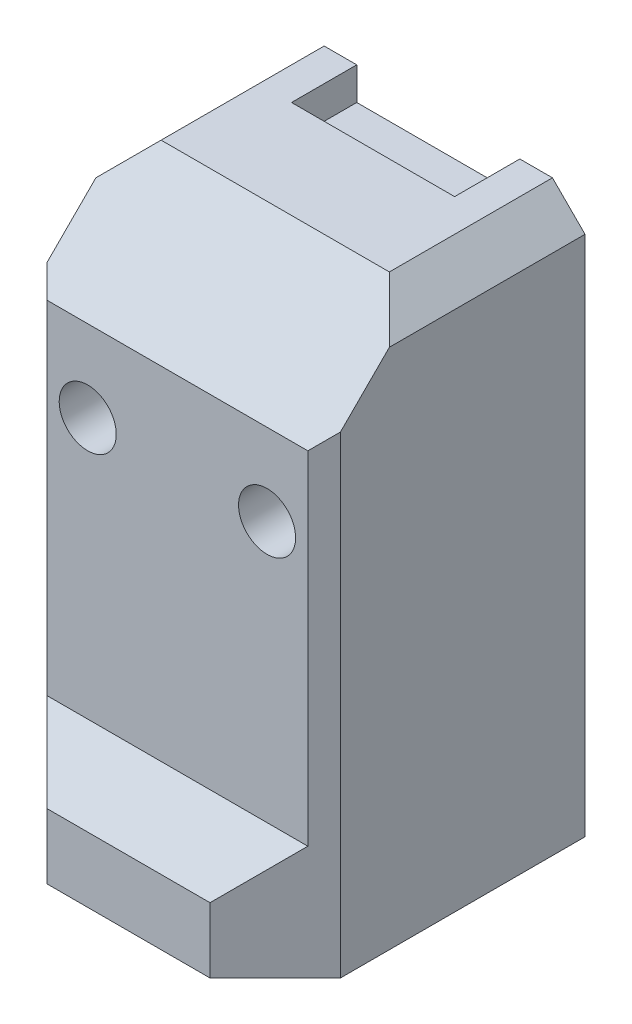
ISO-10303-21;
HEADER;
FILE_DESCRIPTION(('STEP AP214'),'2;1');
FILE_NAME('part.step','',(''),(''),'','','');
FILE_SCHEMA(('AUTOMOTIVE_DESIGN { 1 0 10303 214 1 1 1 1 }'));
ENDSEC;
DATA;
#1=APPLICATION_CONTEXT('core data for automotive mechanical design processes');
#2=APPLICATION_PROTOCOL_DEFINITION('international standard','automotive_design',2000,#1);
#3=PRODUCT_CONTEXT('',#1,'mechanical');
#4=PRODUCT('Part','Part','',(#3));
#5=PRODUCT_RELATED_PRODUCT_CATEGORY('part','',(#4));
#6=PRODUCT_DEFINITION_FORMATION('','',#4);
#7=PRODUCT_DEFINITION_CONTEXT('part definition',#1,'design');
#8=PRODUCT_DEFINITION('design','',#6,#7);
#9=PRODUCT_DEFINITION_SHAPE('','',#8);
#10=(LENGTH_UNIT() NAMED_UNIT(*) SI_UNIT(.MILLI.,.METRE.));
#11=(NAMED_UNIT(*) PLANE_ANGLE_UNIT() SI_UNIT($,.RADIAN.));
#12=(NAMED_UNIT(*) SI_UNIT($,.STERADIAN.) SOLID_ANGLE_UNIT());
#13=UNCERTAINTY_MEASURE_WITH_UNIT(LENGTH_MEASURE(1.E-05),#10,'distance_accuracy_value','');
#14=(GEOMETRIC_REPRESENTATION_CONTEXT(3) GLOBAL_UNCERTAINTY_ASSIGNED_CONTEXT((#13)) GLOBAL_UNIT_ASSIGNED_CONTEXT((#10,
#11,#12)) REPRESENTATION_CONTEXT('',''));
#15=CARTESIAN_POINT('',(0.,0.,0.));
#16=DIRECTION('',(0.,0.,1.));
#17=DIRECTION('',(1.,0.,0.));
#18=AXIS2_PLACEMENT_3D('',#15,#16,#17);
#19=CARTESIAN_POINT('',(0.,0.,19.));
#20=DIRECTION('',(0.,0.,1.));
#21=DIRECTION('',(1.,0.,0.));
#22=AXIS2_PLACEMENT_3D('',#19,#20,#21);
#23=PLANE('',#22);
#24=DIRECTION('',(1.,0.,0.));
#25=VECTOR('',#24,1.);
#26=CARTESIAN_POINT('',(-9.,-13.,19.));
#27=LINE('',#26,#25);
#28=CARTESIAN_POINT('',(-5.,-13.,19.));
#29=VERTEX_POINT('',#28);
#30=CARTESIAN_POINT('',(5.,-13.,19.));
#31=VERTEX_POINT('',#30);
#32=EDGE_CURVE('E194',#29,#31,#27,.T.);
#33=ORIENTED_EDGE('',*,*,#32,.F.);
#34=DIRECTION('',(0.,-1.,0.));
#35=VECTOR('',#34,1.);
#36=CARTESIAN_POINT('',(-5.,-17.,19.));
#37=LINE('',#36,#35);
#38=CARTESIAN_POINT('',(-5.,-17.,19.));
#39=VERTEX_POINT('',#38);
#40=EDGE_CURVE('E296',#29,#39,#37,.T.);
#41=ORIENTED_EDGE('',*,*,#40,.T.);
#42=DIRECTION('',(1.,0.,0.));
#43=VECTOR('',#42,1.);
#44=CARTESIAN_POINT('',(-9.,-17.,19.));
#45=LINE('',#44,#43);
#46=CARTESIAN_POINT('',(5.,-17.,19.));
#47=VERTEX_POINT('',#46);
#48=EDGE_CURVE('E220',#39,#47,#45,.T.);
#49=ORIENTED_EDGE('',*,*,#48,.T.);
#50=DIRECTION('',(0.,1.,0.));
#51=VECTOR('',#50,1.);
#52=CARTESIAN_POINT('',(5.,-13.,19.));
#53=LINE('',#52,#51);
#54=EDGE_CURVE('E292',#47,#31,#53,.T.);
#55=ORIENTED_EDGE('',*,*,#54,.T.);
#56=EDGE_LOOP('',(#33,#41,#49,#55));
#57=FACE_BOUND('',#56,.T.);
#58=ADVANCED_FACE('F45',(#57),#23,.T.);
#59=CARTESIAN_POINT('',(0.,0.,0.));
#60=DIRECTION('',(0.,0.,1.));
#61=DIRECTION('',(1.,0.,0.));
#62=AXIS2_PLACEMENT_3D('',#59,#60,#61);
#63=PLANE('',#62);
#64=DIRECTION('',(-1.,0.,0.));
#65=VECTOR('',#64,1.);
#66=CARTESIAN_POINT('',(-9.,17.,0.));
#67=LINE('',#66,#65);
#68=CARTESIAN_POINT('',(-5.,17.,0.));
#69=VERTEX_POINT('',#68);
#70=CARTESIAN_POINT('',(-7.,17.,0.));
#71=VERTEX_POINT('',#70);
#72=EDGE_CURVE('E229',#69,#71,#67,.T.);
#73=ORIENTED_EDGE('',*,*,#72,.F.);
#74=DIRECTION('',(0.,1.,0.));
#75=VECTOR('',#74,1.);
#76=CARTESIAN_POINT('',(-5.,15.,0.));
#77=LINE('',#76,#75);
#78=CARTESIAN_POINT('',(-5.,15.,0.));
#79=VERTEX_POINT('',#78);
#80=EDGE_CURVE('E191',#79,#69,#77,.T.);
#81=ORIENTED_EDGE('',*,*,#80,.F.);
#82=DIRECTION('',(-1.,0.,0.));
#83=VECTOR('',#82,1.);
#84=CARTESIAN_POINT('',(-5.,15.,0.));
#85=LINE('',#84,#83);
#86=CARTESIAN_POINT('',(5.,15.,0.));
#87=VERTEX_POINT('',#86);
#88=EDGE_CURVE('E162',#87,#79,#85,.T.);
#89=ORIENTED_EDGE('',*,*,#88,.F.);
#90=DIRECTION('',(0.,1.,0.));
#91=VECTOR('',#90,1.);
#92=CARTESIAN_POINT('',(5.,15.,0.));
#93=LINE('',#92,#91);
#94=CARTESIAN_POINT('',(5.,17.,0.));
#95=VERTEX_POINT('',#94);
#96=EDGE_CURVE('E195',#87,#95,#93,.T.);
#97=ORIENTED_EDGE('',*,*,#96,.T.);
#98=CARTESIAN_POINT('',(7.,17.,0.));
#99=VERTEX_POINT('',#98);
#100=EDGE_CURVE('E230',#99,#95,#67,.T.);
#101=ORIENTED_EDGE('',*,*,#100,.F.);
#102=DIRECTION('',(-0.707106781186546,0.707106781186549,0.));
#103=VECTOR('',#102,1.);
#104=CARTESIAN_POINT('',(7.,17.,0.));
#105=LINE('',#104,#103);
#106=CARTESIAN_POINT('',(9.,15.,0.));
#107=VERTEX_POINT('',#106);
#108=EDGE_CURVE('E268',#99,#107,#105,.F.);
#109=ORIENTED_EDGE('',*,*,#108,.T.);
#110=DIRECTION('',(0.,1.,0.));
#111=VECTOR('',#110,1.);
#112=CARTESIAN_POINT('',(9.,17.,0.));
#113=LINE('',#112,#111);
#114=CARTESIAN_POINT('',(9.,-17.,0.));
#115=VERTEX_POINT('',#114);
#116=EDGE_CURVE('E219',#115,#107,#113,.T.);
#117=ORIENTED_EDGE('',*,*,#116,.F.);
#118=DIRECTION('',(1.,0.,0.));
#119=VECTOR('',#118,1.);
#120=CARTESIAN_POINT('',(-9.,-17.,0.));
#121=LINE('',#120,#119);
#122=CARTESIAN_POINT('',(-9.,-17.,0.));
#123=VERTEX_POINT('',#122);
#124=EDGE_CURVE('E225',#123,#115,#121,.T.);
#125=ORIENTED_EDGE('',*,*,#124,.F.);
#126=DIRECTION('',(0.,-1.,0.));
#127=VECTOR('',#126,1.);
#128=CARTESIAN_POINT('',(-9.,17.,0.));
#129=LINE('',#128,#127);
#130=CARTESIAN_POINT('',(-9.,15.,0.));
#131=VERTEX_POINT('',#130);
#132=EDGE_CURVE('E234',#131,#123,#129,.T.);
#133=ORIENTED_EDGE('',*,*,#132,.F.);
#134=DIRECTION('',(-0.707106781186548,-0.707106781186547,0.));
#135=VECTOR('',#134,1.);
#136=CARTESIAN_POINT('',(-9.,15.,0.));
#137=LINE('',#136,#135);
#138=EDGE_CURVE('E271',#131,#71,#137,.F.);
#139=ORIENTED_EDGE('',*,*,#138,.T.);
#140=EDGE_LOOP('',(#73,#81,#89,#97,#101,#109,#117,#125,#133,#139));
#141=FACE_BOUND('',#140,.T.);
#142=CARTESIAN_POINT('',(5.5,6.,0.));
#143=DIRECTION('',(0.,0.,1.));
#144=DIRECTION('',(1.,0.,0.));
#145=AXIS2_PLACEMENT_3D('',#142,#143,#144);
#146=CIRCLE('',#145,1.75);
#147=CARTESIAN_POINT('',(7.25,6.,0.));
#148=VERTEX_POINT('',#147);
#149=EDGE_CURVE('E215',#148,#148,#146,.T.);
#150=ORIENTED_EDGE('',*,*,#149,.T.);
#151=EDGE_LOOP('',(#150));
#152=FACE_BOUND('',#151,.T.);
#153=CARTESIAN_POINT('',(-5.5,6.,0.));
#154=DIRECTION('',(0.,0.,1.));
#155=DIRECTION('',(1.,0.,0.));
#156=AXIS2_PLACEMENT_3D('',#153,#154,#155);
#157=CIRCLE('',#156,1.75);
#158=CARTESIAN_POINT('',(-3.75,6.,0.));
#159=VERTEX_POINT('',#158);
#160=EDGE_CURVE('E211',#159,#159,#157,.T.);
#161=ORIENTED_EDGE('',*,*,#160,.T.);
#162=EDGE_LOOP('',(#161));
#163=FACE_BOUND('',#162,.T.);
#164=ADVANCED_FACE('F347',(#141,#152,#163),#63,.F.);
#165=CARTESIAN_POINT('',(9.,17.,19.));
#166=DIRECTION('',(-1.,0.,0.));
#167=DIRECTION('',(0.,-1.,0.));
#168=AXIS2_PLACEMENT_3D('',#165,#166,#167);
#169=PLANE('',#168);
#170=DIRECTION('',(0.,0.707106781186549,-0.707106781186546));
#171=VECTOR('',#170,1.);
#172=CARTESIAN_POINT('',(9.,17.,9.99999999999999));
#173=LINE('',#172,#171);
#174=CARTESIAN_POINT('',(9.,15.,12.));
#175=VERTEX_POINT('',#174);
#176=CARTESIAN_POINT('',(9.,12.,15.));
#177=VERTEX_POINT('',#176);
#178=EDGE_CURVE('E253',#175,#177,#173,.F.);
#179=ORIENTED_EDGE('',*,*,#178,.T.);
#180=DIRECTION('',(0.,-1.,0.));
#181=VECTOR('',#180,1.);
#182=CARTESIAN_POINT('',(9.,-17.,15.));
#183=LINE('',#182,#181);
#184=CARTESIAN_POINT('',(9.,-17.,15.));
#185=VERTEX_POINT('',#184);
#186=EDGE_CURVE('E11',#177,#185,#183,.T.);
#187=ORIENTED_EDGE('',*,*,#186,.T.);
#188=DIRECTION('',(0.,0.,-1.));
#189=VECTOR('',#188,1.);
#190=CARTESIAN_POINT('',(9.,-17.,19.));
#191=LINE('',#190,#189);
#192=EDGE_CURVE('E224',#185,#115,#191,.T.);
#193=ORIENTED_EDGE('',*,*,#192,.T.);
#194=ORIENTED_EDGE('',*,*,#116,.T.);
#195=DIRECTION('',(0.,0.,1.));
#196=VECTOR('',#195,1.);
#197=CARTESIAN_POINT('',(9.,15.,19.));
#198=LINE('',#197,#196);
#199=EDGE_CURVE('E289',#107,#175,#198,.T.);
#200=ORIENTED_EDGE('',*,*,#199,.T.);
#201=EDGE_LOOP('',(#179,#187,#193,#194,#200));
#202=FACE_BOUND('',#201,.T.);
#203=ADVANCED_FACE('F377',(#202),#169,.F.);
#204=CARTESIAN_POINT('',(-9.,17.,19.));
#205=DIRECTION('',(0.,-1.,0.));
#206=DIRECTION('',(0.,0.,-1.));
#207=AXIS2_PLACEMENT_3D('',#204,#205,#206);
#208=PLANE('',#207);
#209=DIRECTION('',(1.,0.,0.));
#210=VECTOR('',#209,1.);
#211=CARTESIAN_POINT('',(-5.,17.,4.));
#212=LINE('',#211,#210);
#213=CARTESIAN_POINT('',(-5.,17.,4.));
#214=VERTEX_POINT('',#213);
#215=CARTESIAN_POINT('',(5.,17.,4.));
#216=VERTEX_POINT('',#215);
#217=EDGE_CURVE('E180',#214,#216,#212,.T.);
#218=ORIENTED_EDGE('',*,*,#217,.F.);
#219=DIRECTION('',(0.,0.,1.));
#220=VECTOR('',#219,1.);
#221=CARTESIAN_POINT('',(-5.,17.,0.));
#222=LINE('',#221,#220);
#223=EDGE_CURVE('E62',#69,#214,#222,.T.);
#224=ORIENTED_EDGE('',*,*,#223,.F.);
#225=ORIENTED_EDGE('',*,*,#72,.T.);
#226=DIRECTION('',(0.,0.,1.));
#227=VECTOR('',#226,1.);
#228=CARTESIAN_POINT('',(-7.,17.,19.));
#229=LINE('',#228,#227);
#230=CARTESIAN_POINT('',(-7.,17.,9.99999999999999));
#231=VERTEX_POINT('',#230);
#232=EDGE_CURVE('E279',#71,#231,#229,.T.);
#233=ORIENTED_EDGE('',*,*,#232,.T.);
#234=DIRECTION('',(1.,0.,0.));
#235=VECTOR('',#234,1.);
#236=CARTESIAN_POINT('',(-9.,17.,9.99999999999999));
#237=LINE('',#236,#235);
#238=CARTESIAN_POINT('',(7.,17.,9.99999999999999));
#239=VERTEX_POINT('',#238);
#240=EDGE_CURVE('E246',#231,#239,#237,.T.);
#241=ORIENTED_EDGE('',*,*,#240,.T.);
#242=DIRECTION('',(0.,0.,-1.));
#243=VECTOR('',#242,1.);
#244=CARTESIAN_POINT('',(7.,17.,19.));
#245=LINE('',#244,#243);
#246=EDGE_CURVE('E275',#239,#99,#245,.T.);
#247=ORIENTED_EDGE('',*,*,#246,.T.);
#248=ORIENTED_EDGE('',*,*,#100,.T.);
#249=DIRECTION('',(0.,0.,-1.));
#250=VECTOR('',#249,1.);
#251=CARTESIAN_POINT('',(5.,17.,0.));
#252=LINE('',#251,#250);
#253=EDGE_CURVE('E177',#216,#95,#252,.T.);
#254=ORIENTED_EDGE('',*,*,#253,.F.);
#255=EDGE_LOOP('',(#218,#224,#225,#233,#241,#247,#248,#254));
#256=FACE_BOUND('',#255,.T.);
#257=ADVANCED_FACE('F369',(#256),#208,.F.);
#258=CARTESIAN_POINT('',(-9.,17.,19.));
#259=DIRECTION('',(1.,0.,0.));
#260=DIRECTION('',(0.,1.,0.));
#261=AXIS2_PLACEMENT_3D('',#258,#259,#260);
#262=PLANE('',#261);
#263=DIRECTION('',(0.,0.,-1.));
#264=VECTOR('',#263,1.);
#265=CARTESIAN_POINT('',(-9.,-17.,19.));
#266=LINE('',#265,#264);
#267=CARTESIAN_POINT('',(-9.,-17.,15.));
#268=VERTEX_POINT('',#267);
#269=EDGE_CURVE('E243',#268,#123,#266,.T.);
#270=ORIENTED_EDGE('',*,*,#269,.F.);
#271=DIRECTION('',(0.,1.,0.));
#272=VECTOR('',#271,1.);
#273=CARTESIAN_POINT('',(-9.,-13.,15.));
#274=LINE('',#273,#272);
#275=CARTESIAN_POINT('',(-9.,12.,15.));
#276=VERTEX_POINT('',#275);
#277=EDGE_CURVE('E306',#268,#276,#274,.T.);
#278=ORIENTED_EDGE('',*,*,#277,.T.);
#279=DIRECTION('',(0.,-0.707106781186549,0.707106781186546));
#280=VECTOR('',#279,1.);
#281=CARTESIAN_POINT('',(-9.,17.,9.99999999999999));
#282=LINE('',#281,#280);
#283=CARTESIAN_POINT('',(-9.,15.,12.));
#284=VERTEX_POINT('',#283);
#285=EDGE_CURVE('E261',#276,#284,#282,.F.);
#286=ORIENTED_EDGE('',*,*,#285,.T.);
#287=DIRECTION('',(0.,0.,-1.));
#288=VECTOR('',#287,1.);
#289=CARTESIAN_POINT('',(-9.,15.,19.));
#290=LINE('',#289,#288);
#291=EDGE_CURVE('E264',#284,#131,#290,.T.);
#292=ORIENTED_EDGE('',*,*,#291,.T.);
#293=ORIENTED_EDGE('',*,*,#132,.T.);
#294=EDGE_LOOP('',(#270,#278,#286,#292,#293));
#295=FACE_BOUND('',#294,.T.);
#296=ADVANCED_FACE('F339',(#295),#262,.F.);
#297=CARTESIAN_POINT('',(-9.,-17.,19.));
#298=DIRECTION('',(0.,1.,0.));
#299=DIRECTION('',(0.,0.,1.));
#300=AXIS2_PLACEMENT_3D('',#297,#298,#299);
#301=PLANE('',#300);
#302=ORIENTED_EDGE('',*,*,#48,.F.);
#303=DIRECTION('',(-0.707106781186547,0.,-0.707106781186548));
#304=VECTOR('',#303,1.);
#305=CARTESIAN_POINT('',(-5.,-17.,19.));
#306=LINE('',#305,#304);
#307=EDGE_CURVE('E303',#39,#268,#306,.T.);
#308=ORIENTED_EDGE('',*,*,#307,.T.);
#309=ORIENTED_EDGE('',*,*,#269,.T.);
#310=ORIENTED_EDGE('',*,*,#124,.T.);
#311=ORIENTED_EDGE('',*,*,#192,.F.);
#312=DIRECTION('',(-0.707106781186547,0.,0.707106781186548));
#313=VECTOR('',#312,1.);
#314=CARTESIAN_POINT('',(5.,-17.,19.));
#315=LINE('',#314,#313);
#316=EDGE_CURVE('E300',#185,#47,#315,.T.);
#317=ORIENTED_EDGE('',*,*,#316,.T.);
#318=EDGE_LOOP('',(#302,#308,#309,#310,#311,#317));
#319=FACE_BOUND('',#318,.T.);
#320=ADVANCED_FACE('F337',(#319),#301,.F.);
#321=CARTESIAN_POINT('',(5.5,6.,19.));
#322=DIRECTION('',(0.,0.,-1.));
#323=DIRECTION('',(-1.,0.,0.));
#324=AXIS2_PLACEMENT_3D('',#321,#322,#323);
#325=CYLINDRICAL_SURFACE('',#324,1.75);
#326=CARTESIAN_POINT('',(5.5,6.,16.));
#327=DIRECTION('',(0.,0.,-1.));
#328=DIRECTION('',(0.,1.,0.));
#329=AXIS2_PLACEMENT_3D('',#326,#327,#328);
#330=CIRCLE('',#329,1.75);
#331=CARTESIAN_POINT('',(5.5,7.75,16.));
#332=VERTEX_POINT('',#331);
#333=EDGE_CURVE('E207',#332,#332,#330,.T.);
#334=ORIENTED_EDGE('',*,*,#333,.F.);
#335=EDGE_LOOP('',(#334));
#336=FACE_BOUND('',#335,.T.);
#337=ORIENTED_EDGE('',*,*,#149,.F.);
#338=EDGE_LOOP('',(#337));
#339=FACE_BOUND('',#338,.T.);
#340=ADVANCED_FACE('F395',(#336,#339),#325,.F.);
#341=CARTESIAN_POINT('',(-5.5,6.,19.));
#342=DIRECTION('',(0.,0.,-1.));
#343=DIRECTION('',(-1.,0.,0.));
#344=AXIS2_PLACEMENT_3D('',#341,#342,#343);
#345=CYLINDRICAL_SURFACE('',#344,1.75);
#346=CARTESIAN_POINT('',(-5.5,6.,16.));
#347=DIRECTION('',(0.,0.,-1.));
#348=DIRECTION('',(0.,1.,0.));
#349=AXIS2_PLACEMENT_3D('',#346,#347,#348);
#350=CIRCLE('',#349,1.75);
#351=CARTESIAN_POINT('',(-5.5,7.75,16.));
#352=VERTEX_POINT('',#351);
#353=EDGE_CURVE('E204',#352,#352,#350,.T.);
#354=ORIENTED_EDGE('',*,*,#353,.F.);
#355=EDGE_LOOP('',(#354));
#356=FACE_BOUND('',#355,.T.);
#357=ORIENTED_EDGE('',*,*,#160,.F.);
#358=EDGE_LOOP('',(#357));
#359=FACE_BOUND('',#358,.T.);
#360=ADVANCED_FACE('F427',(#356,#359),#345,.F.);
#361=CARTESIAN_POINT('',(-9.,17.,16.));
#362=DIRECTION('',(0.,0.,-1.));
#363=DIRECTION('',(0.,1.,0.));
#364=AXIS2_PLACEMENT_3D('',#361,#362,#363);
#365=PLANE('',#364);
#366=ORIENTED_EDGE('',*,*,#333,.T.);
#367=EDGE_LOOP('',(#366));
#368=FACE_BOUND('',#367,.T.);
#369=ORIENTED_EDGE('',*,*,#353,.T.);
#370=EDGE_LOOP('',(#369));
#371=FACE_BOUND('',#370,.T.);
#372=DIRECTION('',(-1.,0.,0.));
#373=VECTOR('',#372,1.);
#374=CARTESIAN_POINT('',(-9.,11.,16.));
#375=LINE('',#374,#373);
#376=CARTESIAN_POINT('',(7.99999999999999,11.,16.));
#377=VERTEX_POINT('',#376);
#378=CARTESIAN_POINT('',(-7.99999999999999,11.,16.));
#379=VERTEX_POINT('',#378);
#380=EDGE_CURVE('E257',#377,#379,#375,.T.);
#381=ORIENTED_EDGE('',*,*,#380,.T.);
#382=DIRECTION('',(0.,-1.,0.));
#383=VECTOR('',#382,1.);
#384=CARTESIAN_POINT('',(-7.99999999999999,0.,16.));
#385=LINE('',#384,#383);
#386=CARTESIAN_POINT('',(-7.99999999999999,-9.99999999999999,16.));
#387=VERTEX_POINT('',#386);
#388=EDGE_CURVE('E318',#379,#387,#385,.T.);
#389=ORIENTED_EDGE('',*,*,#388,.T.);
#390=DIRECTION('',(1.,0.,0.));
#391=VECTOR('',#390,1.);
#392=CARTESIAN_POINT('',(-9.,-9.99999999999999,16.));
#393=LINE('',#392,#391);
#394=CARTESIAN_POINT('',(7.99999999999999,-9.99999999999999,16.));
#395=VERTEX_POINT('',#394);
#396=EDGE_CURVE('E201',#387,#395,#393,.T.);
#397=ORIENTED_EDGE('',*,*,#396,.T.);
#398=DIRECTION('',(0.,1.,0.));
#399=VECTOR('',#398,1.);
#400=CARTESIAN_POINT('',(7.99999999999999,0.,16.));
#401=LINE('',#400,#399);
#402=EDGE_CURVE('E315',#395,#377,#401,.T.);
#403=ORIENTED_EDGE('',*,*,#402,.T.);
#404=EDGE_LOOP('',(#381,#389,#397,#403));
#405=FACE_BOUND('',#404,.T.);
#406=ADVANCED_FACE('F358',(#368,#371,#405),#365,.F.);
#407=CARTESIAN_POINT('',(-9.,-9.99999999999999,16.));
#408=DIRECTION('',(0.,-0.707106781186547,-0.707106781186547));
#409=DIRECTION('',(0.,0.707106781186548,-0.707106781186548));
#410=AXIS2_PLACEMENT_3D('',#407,#408,#409);
#411=PLANE('',#410);
#412=ORIENTED_EDGE('',*,*,#396,.F.);
#413=DIRECTION('',(0.577350269189625,-0.577350269189626,0.577350269189626));
#414=VECTOR('',#413,1.);
#415=CARTESIAN_POINT('',(-9.33333333333333,-8.66666666666666,14.6666666666667));
#416=LINE('',#415,#414);
#417=EDGE_CURVE('E55',#387,#29,#416,.T.);
#418=ORIENTED_EDGE('',*,*,#417,.T.);
#419=ORIENTED_EDGE('',*,*,#32,.T.);
#420=DIRECTION('',(0.577350269189625,0.577350269189626,-0.577350269189626));
#421=VECTOR('',#420,1.);
#422=CARTESIAN_POINT('',(9.33333333333333,-8.66666666666666,14.6666666666667));
#423=LINE('',#422,#421);
#424=EDGE_CURVE('E70',#31,#395,#423,.T.);
#425=ORIENTED_EDGE('',*,*,#424,.T.);
#426=EDGE_LOOP('',(#412,#418,#419,#425));
#427=FACE_BOUND('',#426,.T.);
#428=ADVANCED_FACE('F325',(#427),#411,.F.);
#429=CARTESIAN_POINT('',(-9.,17.,9.99999999999999));
#430=DIRECTION('',(0.,-0.707106781186546,-0.707106781186549));
#431=DIRECTION('',(1.,0.,0.));
#432=AXIS2_PLACEMENT_3D('',#429,#430,#431);
#433=PLANE('',#432);
#434=ORIENTED_EDGE('',*,*,#285,.F.);
#435=DIRECTION('',(-0.577350269189624,0.577350269189628,-0.577350269189626));
#436=VECTOR('',#435,1.);
#437=CARTESIAN_POINT('',(-12.3333333333333,15.3333333333333,11.6666666666666));
#438=LINE('',#437,#436);
#439=EDGE_CURVE('E312',#276,#379,#438,.F.);
#440=ORIENTED_EDGE('',*,*,#439,.T.);
#441=ORIENTED_EDGE('',*,*,#380,.F.);
#442=DIRECTION('',(-0.577350269189624,-0.577350269189628,0.577350269189626));
#443=VECTOR('',#442,1.);
#444=CARTESIAN_POINT('',(6.33333333333337,9.33333333333334,17.6666666666666));
#445=LINE('',#444,#443);
#446=EDGE_CURVE('E309',#377,#177,#445,.F.);
#447=ORIENTED_EDGE('',*,*,#446,.T.);
#448=ORIENTED_EDGE('',*,*,#178,.F.);
#449=DIRECTION('',(-0.577350269189625,0.577350269189627,-0.577350269189625));
#450=VECTOR('',#449,1.);
#451=CARTESIAN_POINT('',(1.66666666666668,22.3333333333333,4.66666666666667));
#452=LINE('',#451,#450);
#453=EDGE_CURVE('E282',#175,#239,#452,.T.);
#454=ORIENTED_EDGE('',*,*,#453,.T.);
#455=ORIENTED_EDGE('',*,*,#240,.F.);
#456=DIRECTION('',(-0.577350269189627,-0.577350269189626,0.577350269189624));
#457=VECTOR('',#456,1.);
#458=CARTESIAN_POINT('',(-7.66666666666667,16.3333333333333,10.6666666666667));
#459=LINE('',#458,#457);
#460=EDGE_CURVE('E285',#231,#284,#459,.T.);
#461=ORIENTED_EDGE('',*,*,#460,.T.);
#462=EDGE_LOOP('',(#434,#440,#441,#447,#448,#454,#455,#461));
#463=FACE_BOUND('',#462,.T.);
#464=ADVANCED_FACE('F360',(#463),#433,.F.);
#465=CARTESIAN_POINT('',(-9.,15.,19.));
#466=DIRECTION('',(0.707106781186547,-0.707106781186548,0.));
#467=DIRECTION('',(0.,0.,-1.));
#468=AXIS2_PLACEMENT_3D('',#465,#466,#467);
#469=PLANE('',#468);
#470=ORIENTED_EDGE('',*,*,#460,.F.);
#471=ORIENTED_EDGE('',*,*,#232,.F.);
#472=ORIENTED_EDGE('',*,*,#138,.F.);
#473=ORIENTED_EDGE('',*,*,#291,.F.);
#474=EDGE_LOOP('',(#470,#471,#472,#473));
#475=FACE_BOUND('',#474,.T.);
#476=ADVANCED_FACE('F366',(#475),#469,.F.);
#477=CARTESIAN_POINT('',(7.,17.,19.));
#478=DIRECTION('',(-0.707106781186549,-0.707106781186546,0.));
#479=DIRECTION('',(0.,0.,-1.));
#480=AXIS2_PLACEMENT_3D('',#477,#478,#479);
#481=PLANE('',#480);
#482=ORIENTED_EDGE('',*,*,#453,.F.);
#483=ORIENTED_EDGE('',*,*,#199,.F.);
#484=ORIENTED_EDGE('',*,*,#108,.F.);
#485=ORIENTED_EDGE('',*,*,#246,.F.);
#486=EDGE_LOOP('',(#482,#483,#484,#485));
#487=FACE_BOUND('',#486,.T.);
#488=ADVANCED_FACE('F379',(#487),#481,.F.);
#489=CARTESIAN_POINT('',(-5.,0.,19.));
#490=DIRECTION('',(-0.707106781186548,0.,0.707106781186547));
#491=DIRECTION('',(0.,1.,0.));
#492=AXIS2_PLACEMENT_3D('',#489,#490,#491);
#493=PLANE('',#492);
#494=ORIENTED_EDGE('',*,*,#439,.F.);
#495=ORIENTED_EDGE('',*,*,#277,.F.);
#496=ORIENTED_EDGE('',*,*,#307,.F.);
#497=ORIENTED_EDGE('',*,*,#40,.F.);
#498=ORIENTED_EDGE('',*,*,#417,.F.);
#499=ORIENTED_EDGE('',*,*,#388,.F.);
#500=EDGE_LOOP('',(#494,#495,#496,#497,#498,#499));
#501=FACE_BOUND('',#500,.T.);
#502=ADVANCED_FACE('F333',(#501),#493,.T.);
#503=CARTESIAN_POINT('',(5.,0.,19.));
#504=DIRECTION('',(0.707106781186548,0.,0.707106781186547));
#505=DIRECTION('',(0.,-1.,0.));
#506=AXIS2_PLACEMENT_3D('',#503,#504,#505);
#507=PLANE('',#506);
#508=ORIENTED_EDGE('',*,*,#316,.F.);
#509=ORIENTED_EDGE('',*,*,#186,.F.);
#510=ORIENTED_EDGE('',*,*,#446,.F.);
#511=ORIENTED_EDGE('',*,*,#402,.F.);
#512=ORIENTED_EDGE('',*,*,#424,.F.);
#513=ORIENTED_EDGE('',*,*,#54,.F.);
#514=EDGE_LOOP('',(#508,#509,#510,#511,#512,#513));
#515=FACE_BOUND('',#514,.T.);
#516=ADVANCED_FACE('F48',(#515),#507,.T.);
#517=CARTESIAN_POINT('',(-5.,15.,0.));
#518=DIRECTION('',(-1.,0.,0.));
#519=DIRECTION('',(0.,0.,1.));
#520=AXIS2_PLACEMENT_3D('',#517,#518,#519);
#521=PLANE('',#520);
#522=ORIENTED_EDGE('',*,*,#223,.T.);
#523=DIRECTION('',(0.,1.,0.));
#524=VECTOR('',#523,1.);
#525=CARTESIAN_POINT('',(-5.,15.,4.));
#526=LINE('',#525,#524);
#527=CARTESIAN_POINT('',(-5.,15.,4.));
#528=VERTEX_POINT('',#527);
#529=EDGE_CURVE('E151',#528,#214,#526,.T.);
#530=ORIENTED_EDGE('',*,*,#529,.F.);
#531=DIRECTION('',(0.,0.,1.));
#532=VECTOR('',#531,1.);
#533=CARTESIAN_POINT('',(-5.,15.,0.));
#534=LINE('',#533,#532);
#535=EDGE_CURVE('E155',#79,#528,#534,.T.);
#536=ORIENTED_EDGE('',*,*,#535,.F.);
#537=ORIENTED_EDGE('',*,*,#80,.T.);
#538=EDGE_LOOP('',(#522,#530,#536,#537));
#539=FACE_BOUND('',#538,.T.);
#540=ADVANCED_FACE('F153',(#539),#521,.F.);
#541=CARTESIAN_POINT('',(5.,15.,0.));
#542=DIRECTION('',(1.,0.,0.));
#543=DIRECTION('',(0.,0.,-1.));
#544=AXIS2_PLACEMENT_3D('',#541,#542,#543);
#545=PLANE('',#544);
#546=ORIENTED_EDGE('',*,*,#253,.T.);
#547=ORIENTED_EDGE('',*,*,#96,.F.);
#548=DIRECTION('',(0.,0.,-1.));
#549=VECTOR('',#548,1.);
#550=CARTESIAN_POINT('',(5.,15.,0.));
#551=LINE('',#550,#549);
#552=CARTESIAN_POINT('',(5.,15.,4.));
#553=VERTEX_POINT('',#552);
#554=EDGE_CURVE('E171',#553,#87,#551,.T.);
#555=ORIENTED_EDGE('',*,*,#554,.F.);
#556=DIRECTION('',(0.,1.,0.));
#557=VECTOR('',#556,1.);
#558=CARTESIAN_POINT('',(5.,15.,4.));
#559=LINE('',#558,#557);
#560=EDGE_CURVE('E161',#553,#216,#559,.T.);
#561=ORIENTED_EDGE('',*,*,#560,.T.);
#562=EDGE_LOOP('',(#546,#547,#555,#561));
#563=FACE_BOUND('',#562,.T.);
#564=ADVANCED_FACE('F373',(#563),#545,.F.);
#565=CARTESIAN_POINT('',(-5.,15.,4.));
#566=DIRECTION('',(0.,0.,1.));
#567=DIRECTION('',(1.,0.,0.));
#568=AXIS2_PLACEMENT_3D('',#565,#566,#567);
#569=PLANE('',#568);
#570=ORIENTED_EDGE('',*,*,#217,.T.);
#571=ORIENTED_EDGE('',*,*,#560,.F.);
#572=DIRECTION('',(1.,0.,0.));
#573=VECTOR('',#572,1.);
#574=CARTESIAN_POINT('',(-5.,15.,4.));
#575=LINE('',#574,#573);
#576=EDGE_CURVE('E165',#528,#553,#575,.T.);
#577=ORIENTED_EDGE('',*,*,#576,.F.);
#578=ORIENTED_EDGE('',*,*,#529,.T.);
#579=EDGE_LOOP('',(#570,#571,#577,#578));
#580=FACE_BOUND('',#579,.T.);
#581=ADVANCED_FACE('F166',(#580),#569,.F.);
#582=CARTESIAN_POINT('',(0.,15.,0.));
#583=DIRECTION('',(0.,1.,0.));
#584=DIRECTION('',(0.,0.,1.));
#585=AXIS2_PLACEMENT_3D('',#582,#583,#584);
#586=PLANE('',#585);
#587=ORIENTED_EDGE('',*,*,#535,.T.);
#588=ORIENTED_EDGE('',*,*,#576,.T.);
#589=ORIENTED_EDGE('',*,*,#554,.T.);
#590=ORIENTED_EDGE('',*,*,#88,.T.);
#591=EDGE_LOOP('',(#587,#588,#589,#590));
#592=FACE_BOUND('',#591,.T.);
#593=ADVANCED_FACE('F173',(#592),#586,.T.);
#594=CLOSED_SHELL('',(#58,#164,#203,#257,#296,#320,#340,#360,#406,#428,#464,#476,#488,#502,#516,
#540,#564,#581,#593));
#595=MANIFOLD_SOLID_BREP('B2',#594);
#596=ADVANCED_BREP_SHAPE_REPRESENTATION('',(#18,#595),#14);
#597=SHAPE_DEFINITION_REPRESENTATION(#9,#596);
ENDSEC;
END-ISO-10303-21;
